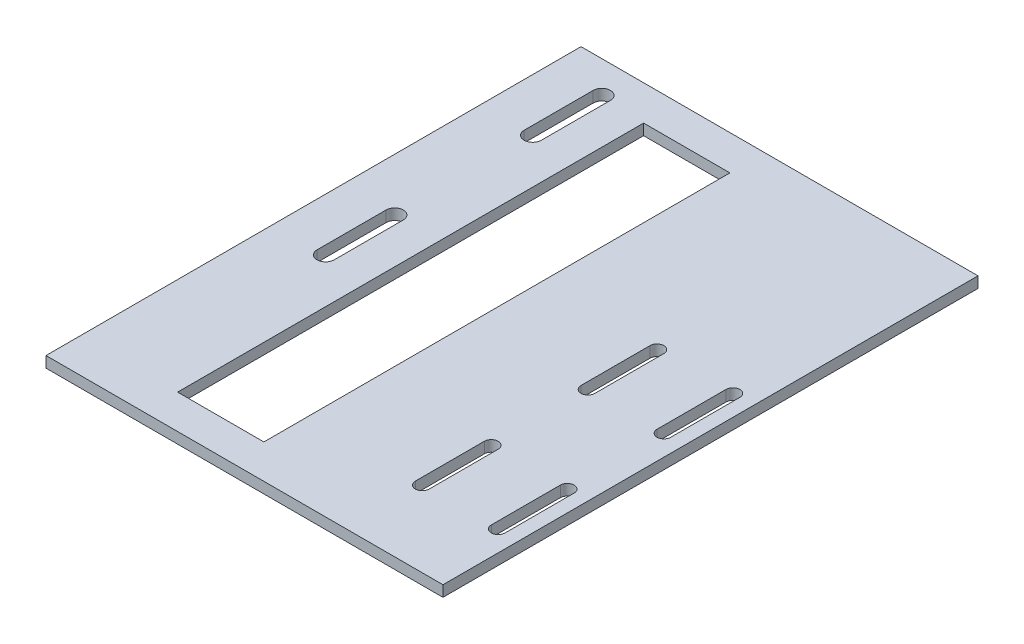
ISO-10303-21;
HEADER;
FILE_DESCRIPTION(('STEP AP214'),'2;1');
FILE_NAME('part.step','',(''),(''),'','','');
FILE_SCHEMA(('AUTOMOTIVE_DESIGN { 1 0 10303 214 1 1 1 1 }'));
ENDSEC;
DATA;
#1=APPLICATION_CONTEXT('core data for automotive mechanical design processes');
#2=APPLICATION_PROTOCOL_DEFINITION('international standard','automotive_design',2000,#1);
#3=PRODUCT_CONTEXT('',#1,'mechanical');
#4=PRODUCT('Part','Part','',(#3));
#5=PRODUCT_RELATED_PRODUCT_CATEGORY('part','',(#4));
#6=PRODUCT_DEFINITION_FORMATION('','',#4);
#7=PRODUCT_DEFINITION_CONTEXT('part definition',#1,'design');
#8=PRODUCT_DEFINITION('design','',#6,#7);
#9=PRODUCT_DEFINITION_SHAPE('','',#8);
#10=(LENGTH_UNIT() NAMED_UNIT(*) SI_UNIT(.MILLI.,.METRE.));
#11=(NAMED_UNIT(*) PLANE_ANGLE_UNIT() SI_UNIT($,.RADIAN.));
#12=(NAMED_UNIT(*) SI_UNIT($,.STERADIAN.) SOLID_ANGLE_UNIT());
#13=UNCERTAINTY_MEASURE_WITH_UNIT(LENGTH_MEASURE(1.E-05),#10,'distance_accuracy_value','');
#14=(GEOMETRIC_REPRESENTATION_CONTEXT(3) GLOBAL_UNCERTAINTY_ASSIGNED_CONTEXT((#13)) GLOBAL_UNIT_ASSIGNED_CONTEXT((#10,
#11,#12)) REPRESENTATION_CONTEXT('',''));
#15=CARTESIAN_POINT('',(0.,0.,0.));
#16=DIRECTION('',(0.,0.,1.));
#17=DIRECTION('',(1.,0.,0.));
#18=AXIS2_PLACEMENT_3D('',#15,#16,#17);
#19=CARTESIAN_POINT('',(0.,3.175,0.));
#20=DIRECTION('',(0.,-1.,0.));
#21=DIRECTION('',(0.,0.,-1.));
#22=AXIS2_PLACEMENT_3D('',#19,#20,#21);
#23=PLANE('',#22);
#24=CARTESIAN_POINT('',(61.6743334663015,3.175,40.3481884473829));
#25=DIRECTION('',(0.,1.,0.));
#26=DIRECTION('',(0.,0.,1.));
#27=AXIS2_PLACEMENT_3D('',#24,#25,#26);
#28=CIRCLE('',#27,1.99999999999983);
#29=CARTESIAN_POINT('',(59.6743334663016,3.175,40.3481884473829));
#30=VERTEX_POINT('',#29);
#31=CARTESIAN_POINT('',(63.6743334663013,3.175,40.3481884473829));
#32=VERTEX_POINT('',#31);
#33=EDGE_CURVE('E297',#30,#32,#28,.T.);
#34=ORIENTED_EDGE('',*,*,#33,.F.);
#35=DIRECTION('',(0.,0.,1.));
#36=VECTOR('',#35,1.);
#37=CARTESIAN_POINT('',(59.6743334663016,3.175,40.3481884473829));
#38=LINE('',#37,#36);
#39=CARTESIAN_POINT('',(59.6743334663016,3.175,20.3481884473829));
#40=VERTEX_POINT('',#39);
#41=EDGE_CURVE('E308',#40,#30,#38,.T.);
#42=ORIENTED_EDGE('',*,*,#41,.F.);
#43=CARTESIAN_POINT('',(61.6743334663016,3.175,20.3481884473829));
#44=DIRECTION('',(0.,1.,0.));
#45=DIRECTION('',(0.,0.,1.));
#46=AXIS2_PLACEMENT_3D('',#43,#44,#45);
#47=CIRCLE('',#46,1.99999999999982);
#48=CARTESIAN_POINT('',(63.6743334663015,3.175,20.3481884473829));
#49=VERTEX_POINT('',#48);
#50=EDGE_CURVE('E304',#49,#40,#47,.T.);
#51=ORIENTED_EDGE('',*,*,#50,.F.);
#52=DIRECTION('',(0.,0.,-1.));
#53=VECTOR('',#52,1.);
#54=CARTESIAN_POINT('',(63.6743334663013,3.175,40.3481884473829));
#55=LINE('',#54,#53);
#56=EDGE_CURVE('E300',#32,#49,#55,.T.);
#57=ORIENTED_EDGE('',*,*,#56,.F.);
#58=EDGE_LOOP('',(#34,#42,#51,#57));
#59=FACE_BOUND('',#58,.T.);
#60=CARTESIAN_POINT('',(-32.086624165376,3.175,-3.42736647473671));
#61=DIRECTION('',(0.,1.,0.));
#62=DIRECTION('',(0.,0.,1.));
#63=AXIS2_PLACEMENT_3D('',#60,#61,#62);
#64=CIRCLE('',#63,2.5);
#65=CARTESIAN_POINT('',(-34.586624165376,3.175,-3.42736647473671));
#66=VERTEX_POINT('',#65);
#67=CARTESIAN_POINT('',(-29.586624165376,3.175,-3.42736647473671));
#68=VERTEX_POINT('',#67);
#69=EDGE_CURVE('E383',#66,#68,#64,.T.);
#70=ORIENTED_EDGE('',*,*,#69,.F.);
#71=DIRECTION('',(0.,0.,1.));
#72=VECTOR('',#71,1.);
#73=CARTESIAN_POINT('',(-34.586624165376,3.175,-3.42736647473671));
#74=LINE('',#73,#72);
#75=CARTESIAN_POINT('',(-34.586624165376,3.175,-23.4273664747367));
#76=VERTEX_POINT('',#75);
#77=EDGE_CURVE('E394',#76,#66,#74,.T.);
#78=ORIENTED_EDGE('',*,*,#77,.F.);
#79=CARTESIAN_POINT('',(-32.086624165376,3.175,-23.4273664747367));
#80=DIRECTION('',(0.,1.,0.));
#81=DIRECTION('',(0.,0.,1.));
#82=AXIS2_PLACEMENT_3D('',#79,#80,#81);
#83=CIRCLE('',#82,2.5);
#84=CARTESIAN_POINT('',(-29.586624165376,3.175,-23.4273664747367));
#85=VERTEX_POINT('',#84);
#86=EDGE_CURVE('E390',#85,#76,#83,.T.);
#87=ORIENTED_EDGE('',*,*,#86,.F.);
#88=DIRECTION('',(0.,0.,-1.));
#89=VECTOR('',#88,1.);
#90=CARTESIAN_POINT('',(-29.586624165376,3.175,-3.42736647473671));
#91=LINE('',#90,#89);
#92=EDGE_CURVE('E386',#68,#85,#91,.T.);
#93=ORIENTED_EDGE('',*,*,#92,.F.);
#94=EDGE_LOOP('',(#70,#78,#87,#93));
#95=FACE_BOUND('',#94,.T.);
#96=CARTESIAN_POINT('',(39.6743334663006,3.175,-7.65181155261708));
#97=DIRECTION('',(0.,1.,0.));
#98=DIRECTION('',(0.,0.,-1.));
#99=AXIS2_PLACEMENT_3D('',#96,#97,#98);
#100=CIRCLE('',#99,2.);
#101=CARTESIAN_POINT('',(37.6743334663006,3.175,-7.65181155261708));
#102=VERTEX_POINT('',#101);
#103=CARTESIAN_POINT('',(41.6743334663006,3.175,-7.65181155261708));
#104=VERTEX_POINT('',#103);
#105=EDGE_CURVE('E469',#102,#104,#100,.T.);
#106=ORIENTED_EDGE('',*,*,#105,.F.);
#107=DIRECTION('',(0.,0.,1.));
#108=VECTOR('',#107,1.);
#109=CARTESIAN_POINT('',(37.6743334663006,3.175,-7.65181155261708));
#110=LINE('',#109,#108);
#111=CARTESIAN_POINT('',(37.6743334663006,3.175,-27.6518115526171));
#112=VERTEX_POINT('',#111);
#113=EDGE_CURVE('E480',#112,#102,#110,.T.);
#114=ORIENTED_EDGE('',*,*,#113,.F.);
#115=CARTESIAN_POINT('',(39.6743334663006,3.175,-27.6518115526171));
#116=DIRECTION('',(0.,1.,0.));
#117=DIRECTION('',(0.,0.,-1.));
#118=AXIS2_PLACEMENT_3D('',#115,#116,#117);
#119=CIRCLE('',#118,2.);
#120=CARTESIAN_POINT('',(41.6743334663006,3.175,-27.6518115526171));
#121=VERTEX_POINT('',#120);
#122=EDGE_CURVE('E476',#121,#112,#119,.T.);
#123=ORIENTED_EDGE('',*,*,#122,.F.);
#124=DIRECTION('',(0.,0.,-1.));
#125=VECTOR('',#124,1.);
#126=CARTESIAN_POINT('',(41.6743334663006,3.175,-7.65181155261708));
#127=LINE('',#126,#125);
#128=EDGE_CURVE('E472',#104,#121,#127,.T.);
#129=ORIENTED_EDGE('',*,*,#128,.F.);
#130=EDGE_LOOP('',(#106,#114,#123,#129));
#131=FACE_BOUND('',#130,.T.);
#132=DIRECTION('',(1.,0.,0.));
#133=VECTOR('',#132,1.);
#134=CARTESIAN_POINT('',(67.674333466301,3.175,62.3481884473829));
#135=LINE('',#134,#133);
#136=CARTESIAN_POINT('',(-47.325666533699,3.175,62.3481884473829));
#137=VERTEX_POINT('',#136);
#138=CARTESIAN_POINT('',(67.674333466301,3.175,62.3481884473829));
#139=VERTEX_POINT('',#138);
#140=EDGE_CURVE('E555',#137,#139,#135,.T.);
#141=ORIENTED_EDGE('',*,*,#140,.T.);
#142=DIRECTION('',(0.,0.,-1.));
#143=VECTOR('',#142,1.);
#144=CARTESIAN_POINT('',(67.674333466301,3.175,-92.6518115526171));
#145=LINE('',#144,#143);
#146=CARTESIAN_POINT('',(67.674333466301,3.175,-92.6518115526171));
#147=VERTEX_POINT('',#146);
#148=EDGE_CURVE('E559',#139,#147,#145,.T.);
#149=ORIENTED_EDGE('',*,*,#148,.T.);
#150=DIRECTION('',(-1.,0.,0.));
#151=VECTOR('',#150,1.);
#152=CARTESIAN_POINT('',(67.674333466301,3.175,-92.6518115526171));
#153=LINE('',#152,#151);
#154=CARTESIAN_POINT('',(-47.325666533699,3.175,-92.6518115526171));
#155=VERTEX_POINT('',#154);
#156=EDGE_CURVE('E563',#147,#155,#153,.T.);
#157=ORIENTED_EDGE('',*,*,#156,.T.);
#158=DIRECTION('',(0.,0.,1.));
#159=VECTOR('',#158,1.);
#160=CARTESIAN_POINT('',(-47.325666533699,3.175,27.0445653421485));
#161=LINE('',#160,#159);
#162=EDGE_CURVE('E566',#155,#137,#161,.T.);
#163=ORIENTED_EDGE('',*,*,#162,.T.);
#164=EDGE_LOOP('',(#141,#149,#157,#163));
#165=FACE_BOUND('',#164,.T.);
#166=DIRECTION('',(0.,0.,1.));
#167=VECTOR('',#166,1.);
#168=CARTESIAN_POINT('',(-19.0866241653807,3.175,-82.5395192353381));
#169=LINE('',#168,#167);
#170=CARTESIAN_POINT('',(-19.0866241653807,3.175,-82.5395192353381));
#171=VERTEX_POINT('',#170);
#172=CARTESIAN_POINT('',(-19.0866241653807,3.175,52.4604807646619));
#173=VERTEX_POINT('',#172);
#174=EDGE_CURVE('E512',#171,#173,#169,.T.);
#175=ORIENTED_EDGE('',*,*,#174,.F.);
#176=DIRECTION('',(-1.,0.,0.));
#177=VECTOR('',#176,1.);
#178=CARTESIAN_POINT('',(-19.0866241653807,3.175,-82.5395192353381));
#179=LINE('',#178,#177);
#180=CARTESIAN_POINT('',(5.91337583461932,3.175,-82.5395192353381));
#181=VERTEX_POINT('',#180);
#182=EDGE_CURVE('E523',#181,#171,#179,.T.);
#183=ORIENTED_EDGE('',*,*,#182,.F.);
#184=DIRECTION('',(0.,0.,-1.));
#185=VECTOR('',#184,1.);
#186=CARTESIAN_POINT('',(5.91337583461932,3.175,-82.5395192353381));
#187=LINE('',#186,#185);
#188=CARTESIAN_POINT('',(5.91337583461935,3.175,52.4604807646619));
#189=VERTEX_POINT('',#188);
#190=EDGE_CURVE('E519',#189,#181,#187,.T.);
#191=ORIENTED_EDGE('',*,*,#190,.F.);
#192=DIRECTION('',(1.,0.,0.));
#193=VECTOR('',#192,1.);
#194=CARTESIAN_POINT('',(-19.0866241653807,3.175,52.4604807646619));
#195=LINE('',#194,#193);
#196=EDGE_CURVE('E515',#173,#189,#195,.T.);
#197=ORIENTED_EDGE('',*,*,#196,.F.);
#198=EDGE_LOOP('',(#175,#183,#191,#197));
#199=FACE_BOUND('',#198,.T.);
#200=CARTESIAN_POINT('',(-32.086624165376,3.175,-63.4273664747312));
#201=DIRECTION('',(0.,1.,0.));
#202=DIRECTION('',(0.,0.,1.));
#203=AXIS2_PLACEMENT_3D('',#200,#201,#202);
#204=CIRCLE('',#203,2.5);
#205=CARTESIAN_POINT('',(-34.586624165376,3.175,-63.4273664747312));
#206=VERTEX_POINT('',#205);
#207=CARTESIAN_POINT('',(-29.586624165376,3.175,-63.4273664747312));
#208=VERTEX_POINT('',#207);
#209=EDGE_CURVE('E426',#206,#208,#204,.T.);
#210=ORIENTED_EDGE('',*,*,#209,.F.);
#211=DIRECTION('',(0.,0.,1.));
#212=VECTOR('',#211,1.);
#213=CARTESIAN_POINT('',(-34.586624165376,3.175,-63.4273664747312));
#214=LINE('',#213,#212);
#215=CARTESIAN_POINT('',(-34.586624165376,3.175,-83.4273664747312));
#216=VERTEX_POINT('',#215);
#217=EDGE_CURVE('E437',#216,#206,#214,.T.);
#218=ORIENTED_EDGE('',*,*,#217,.F.);
#219=CARTESIAN_POINT('',(-32.086624165376,3.175,-83.4273664747312));
#220=DIRECTION('',(0.,1.,0.));
#221=DIRECTION('',(0.,0.,1.));
#222=AXIS2_PLACEMENT_3D('',#219,#220,#221);
#223=CIRCLE('',#222,2.5);
#224=CARTESIAN_POINT('',(-29.586624165376,3.175,-83.4273664747312));
#225=VERTEX_POINT('',#224);
#226=EDGE_CURVE('E433',#225,#216,#223,.T.);
#227=ORIENTED_EDGE('',*,*,#226,.F.);
#228=DIRECTION('',(0.,0.,-1.));
#229=VECTOR('',#228,1.);
#230=CARTESIAN_POINT('',(-29.586624165376,3.175,-63.4273664747312));
#231=LINE('',#230,#229);
#232=EDGE_CURVE('E429',#208,#225,#231,.T.);
#233=ORIENTED_EDGE('',*,*,#232,.F.);
#234=EDGE_LOOP('',(#210,#218,#227,#233));
#235=FACE_BOUND('',#234,.T.);
#236=CARTESIAN_POINT('',(61.6743334663015,3.175,-7.65181155261708));
#237=DIRECTION('',(0.,1.,0.));
#238=DIRECTION('',(0.,0.,1.));
#239=AXIS2_PLACEMENT_3D('',#236,#237,#238);
#240=CIRCLE('',#239,2.);
#241=CARTESIAN_POINT('',(59.6743334663015,3.175,-7.65181155261708));
#242=VERTEX_POINT('',#241);
#243=CARTESIAN_POINT('',(63.6743334663015,3.175,-7.65181155261708));
#244=VERTEX_POINT('',#243);
#245=EDGE_CURVE('E340',#242,#244,#240,.T.);
#246=ORIENTED_EDGE('',*,*,#245,.F.);
#247=DIRECTION('',(0.,0.,1.));
#248=VECTOR('',#247,1.);
#249=CARTESIAN_POINT('',(59.6743334663015,3.175,-7.65181155261708));
#250=LINE('',#249,#248);
#251=CARTESIAN_POINT('',(59.6743334663015,3.175,-27.6518115526171));
#252=VERTEX_POINT('',#251);
#253=EDGE_CURVE('E351',#252,#242,#250,.T.);
#254=ORIENTED_EDGE('',*,*,#253,.F.);
#255=CARTESIAN_POINT('',(61.6743334663015,3.175,-27.6518115526171));
#256=DIRECTION('',(0.,1.,0.));
#257=DIRECTION('',(0.,0.,1.));
#258=AXIS2_PLACEMENT_3D('',#255,#256,#257);
#259=CIRCLE('',#258,2.);
#260=CARTESIAN_POINT('',(63.6743334663015,3.175,-27.6518115526171));
#261=VERTEX_POINT('',#260);
#262=EDGE_CURVE('E347',#261,#252,#259,.T.);
#263=ORIENTED_EDGE('',*,*,#262,.F.);
#264=DIRECTION('',(0.,0.,-1.));
#265=VECTOR('',#264,1.);
#266=CARTESIAN_POINT('',(63.6743334663015,3.175,-7.65181155261708));
#267=LINE('',#266,#265);
#268=EDGE_CURVE('E343',#244,#261,#267,.T.);
#269=ORIENTED_EDGE('',*,*,#268,.F.);
#270=EDGE_LOOP('',(#246,#254,#263,#269));
#271=FACE_BOUND('',#270,.T.);
#272=CARTESIAN_POINT('',(39.6743334663006,3.175,40.3481884473829));
#273=DIRECTION('',(0.,1.,0.));
#274=DIRECTION('',(0.,0.,-1.));
#275=AXIS2_PLACEMENT_3D('',#272,#273,#274);
#276=CIRCLE('',#275,1.99999999999983);
#277=CARTESIAN_POINT('',(37.6743334663007,3.175,40.3481884473829));
#278=VERTEX_POINT('',#277);
#279=CARTESIAN_POINT('',(41.6743334663004,3.175,40.3481884473829));
#280=VERTEX_POINT('',#279);
#281=EDGE_CURVE('E249',#278,#280,#276,.T.);
#282=ORIENTED_EDGE('',*,*,#281,.F.);
#283=DIRECTION('',(0.,0.,1.));
#284=VECTOR('',#283,1.);
#285=CARTESIAN_POINT('',(37.6743334663007,3.175,40.3481884473829));
#286=LINE('',#285,#284);
#287=CARTESIAN_POINT('',(37.6743334663008,3.175,20.3481884473829));
#288=VERTEX_POINT('',#287);
#289=EDGE_CURVE('E275',#288,#278,#286,.T.);
#290=ORIENTED_EDGE('',*,*,#289,.F.);
#291=CARTESIAN_POINT('',(39.6743334663004,3.175,20.3481884473829));
#292=DIRECTION('',(0.,1.,0.));
#293=DIRECTION('',(0.,0.,-1.));
#294=AXIS2_PLACEMENT_3D('',#291,#292,#293);
#295=CIRCLE('',#294,1.99999999999982);
#296=CARTESIAN_POINT('',(41.6743334663004,3.175,20.3481884473829));
#297=VERTEX_POINT('',#296);
#298=EDGE_CURVE('E271',#297,#288,#295,.T.);
#299=ORIENTED_EDGE('',*,*,#298,.F.);
#300=DIRECTION('',(0.,0.,-1.));
#301=VECTOR('',#300,1.);
#302=CARTESIAN_POINT('',(41.6743334663004,3.175,40.3481884473829));
#303=LINE('',#302,#301);
#304=EDGE_CURVE('E258',#280,#297,#303,.T.);
#305=ORIENTED_EDGE('',*,*,#304,.F.);
#306=EDGE_LOOP('',(#282,#290,#299,#305));
#307=FACE_BOUND('',#306,.T.);
#308=ADVANCED_FACE('F39',(#59,#95,#131,#165,#199,#235,#271,#307),#23,.F.);
#309=CARTESIAN_POINT('',(0.,0.,0.));
#310=DIRECTION('',(0.,-1.,0.));
#311=DIRECTION('',(0.,0.,-1.));
#312=AXIS2_PLACEMENT_3D('',#309,#310,#311);
#313=PLANE('',#312);
#314=DIRECTION('',(1.,0.,0.));
#315=VECTOR('',#314,1.);
#316=CARTESIAN_POINT('',(67.674333466301,0.,62.3481884473829));
#317=LINE('',#316,#315);
#318=CARTESIAN_POINT('',(-47.325666533699,0.,62.3481884473829));
#319=VERTEX_POINT('',#318);
#320=CARTESIAN_POINT('',(67.674333466301,0.,62.3481884473829));
#321=VERTEX_POINT('',#320);
#322=EDGE_CURVE('E554',#319,#321,#317,.T.);
#323=ORIENTED_EDGE('',*,*,#322,.F.);
#324=DIRECTION('',(0.,0.,1.));
#325=VECTOR('',#324,1.);
#326=CARTESIAN_POINT('',(-47.325666533699,0.,62.3481884473829));
#327=LINE('',#326,#325);
#328=CARTESIAN_POINT('',(-47.325666533699,0.,-92.6518115526171));
#329=VERTEX_POINT('',#328);
#330=EDGE_CURVE('E560',#329,#319,#327,.T.);
#331=ORIENTED_EDGE('',*,*,#330,.F.);
#332=DIRECTION('',(-1.,0.,0.));
#333=VECTOR('',#332,1.);
#334=CARTESIAN_POINT('',(67.674333466301,0.,-92.6518115526171));
#335=LINE('',#334,#333);
#336=CARTESIAN_POINT('',(67.674333466301,0.,-92.6518115526171));
#337=VERTEX_POINT('',#336);
#338=EDGE_CURVE('E576',#337,#329,#335,.T.);
#339=ORIENTED_EDGE('',*,*,#338,.F.);
#340=DIRECTION('',(0.,0.,-1.));
#341=VECTOR('',#340,1.);
#342=CARTESIAN_POINT('',(67.674333466301,0.,-92.6518115526171));
#343=LINE('',#342,#341);
#344=EDGE_CURVE('E573',#321,#337,#343,.T.);
#345=ORIENTED_EDGE('',*,*,#344,.F.);
#346=EDGE_LOOP('',(#323,#331,#339,#345));
#347=FACE_BOUND('',#346,.T.);
#348=DIRECTION('',(-1.,0.,0.));
#349=VECTOR('',#348,1.);
#350=CARTESIAN_POINT('',(-19.0866241653807,0.,-82.5395192353381));
#351=LINE('',#350,#349);
#352=CARTESIAN_POINT('',(5.91337583461932,0.,-82.5395192353381));
#353=VERTEX_POINT('',#352);
#354=CARTESIAN_POINT('',(-19.0866241653807,0.,-82.5395192353381));
#355=VERTEX_POINT('',#354);
#356=EDGE_CURVE('E516',#353,#355,#351,.T.);
#357=ORIENTED_EDGE('',*,*,#356,.T.);
#358=DIRECTION('',(0.,0.,1.));
#359=VECTOR('',#358,1.);
#360=CARTESIAN_POINT('',(-19.0866241653807,0.,-82.5395192353381));
#361=LINE('',#360,#359);
#362=CARTESIAN_POINT('',(-19.0866241653807,0.,52.4604807646619));
#363=VERTEX_POINT('',#362);
#364=EDGE_CURVE('E511',#355,#363,#361,.T.);
#365=ORIENTED_EDGE('',*,*,#364,.T.);
#366=DIRECTION('',(1.,0.,0.));
#367=VECTOR('',#366,1.);
#368=CARTESIAN_POINT('',(-19.0866241653807,0.,52.4604807646619));
#369=LINE('',#368,#367);
#370=CARTESIAN_POINT('',(5.91337583461935,0.,52.4604807646619));
#371=VERTEX_POINT('',#370);
#372=EDGE_CURVE('E530',#363,#371,#369,.T.);
#373=ORIENTED_EDGE('',*,*,#372,.T.);
#374=DIRECTION('',(0.,0.,-1.));
#375=VECTOR('',#374,1.);
#376=CARTESIAN_POINT('',(5.91337583461932,0.,-82.5395192353381));
#377=LINE('',#376,#375);
#378=EDGE_CURVE('E534',#371,#353,#377,.T.);
#379=ORIENTED_EDGE('',*,*,#378,.T.);
#380=EDGE_LOOP('',(#357,#365,#373,#379));
#381=FACE_BOUND('',#380,.T.);
#382=DIRECTION('',(0.,0.,1.));
#383=VECTOR('',#382,1.);
#384=CARTESIAN_POINT('',(37.6743334663006,0.,-7.65181155261708));
#385=LINE('',#384,#383);
#386=CARTESIAN_POINT('',(37.6743334663006,0.,-27.6518115526171));
#387=VERTEX_POINT('',#386);
#388=CARTESIAN_POINT('',(37.6743334663006,0.,-7.65181155261708));
#389=VERTEX_POINT('',#388);
#390=EDGE_CURVE('E473',#387,#389,#385,.T.);
#391=ORIENTED_EDGE('',*,*,#390,.T.);
#392=CARTESIAN_POINT('',(39.6743334663006,0.,-7.65181155261708));
#393=DIRECTION('',(0.,1.,0.));
#394=DIRECTION('',(0.,0.,-1.));
#395=AXIS2_PLACEMENT_3D('',#392,#393,#394);
#396=CIRCLE('',#395,2.);
#397=CARTESIAN_POINT('',(41.6743334663006,0.,-7.65181155261708));
#398=VERTEX_POINT('',#397);
#399=EDGE_CURVE('E468',#389,#398,#396,.T.);
#400=ORIENTED_EDGE('',*,*,#399,.T.);
#401=DIRECTION('',(0.,0.,-1.));
#402=VECTOR('',#401,1.);
#403=CARTESIAN_POINT('',(41.6743334663006,0.,-7.65181155261708));
#404=LINE('',#403,#402);
#405=CARTESIAN_POINT('',(41.6743334663006,0.,-27.6518115526171));
#406=VERTEX_POINT('',#405);
#407=EDGE_CURVE('E487',#398,#406,#404,.T.);
#408=ORIENTED_EDGE('',*,*,#407,.T.);
#409=CARTESIAN_POINT('',(39.6743334663006,0.,-27.6518115526171));
#410=DIRECTION('',(0.,1.,0.));
#411=DIRECTION('',(0.,0.,-1.));
#412=AXIS2_PLACEMENT_3D('',#409,#410,#411);
#413=CIRCLE('',#412,2.);
#414=EDGE_CURVE('E491',#406,#387,#413,.T.);
#415=ORIENTED_EDGE('',*,*,#414,.T.);
#416=EDGE_LOOP('',(#391,#400,#408,#415));
#417=FACE_BOUND('',#416,.T.);
#418=DIRECTION('',(0.,0.,1.));
#419=VECTOR('',#418,1.);
#420=CARTESIAN_POINT('',(-34.586624165376,0.,-63.4273664747312));
#421=LINE('',#420,#419);
#422=CARTESIAN_POINT('',(-34.586624165376,0.,-83.4273664747312));
#423=VERTEX_POINT('',#422);
#424=CARTESIAN_POINT('',(-34.586624165376,0.,-63.4273664747312));
#425=VERTEX_POINT('',#424);
#426=EDGE_CURVE('E430',#423,#425,#421,.T.);
#427=ORIENTED_EDGE('',*,*,#426,.T.);
#428=CARTESIAN_POINT('',(-32.086624165376,0.,-63.4273664747312));
#429=DIRECTION('',(0.,1.,0.));
#430=DIRECTION('',(0.,0.,1.));
#431=AXIS2_PLACEMENT_3D('',#428,#429,#430);
#432=CIRCLE('',#431,2.5);
#433=CARTESIAN_POINT('',(-29.586624165376,0.,-63.4273664747312));
#434=VERTEX_POINT('',#433);
#435=EDGE_CURVE('E425',#425,#434,#432,.T.);
#436=ORIENTED_EDGE('',*,*,#435,.T.);
#437=DIRECTION('',(0.,0.,-1.));
#438=VECTOR('',#437,1.);
#439=CARTESIAN_POINT('',(-29.586624165376,0.,-63.4273664747312));
#440=LINE('',#439,#438);
#441=CARTESIAN_POINT('',(-29.586624165376,0.,-83.4273664747312));
#442=VERTEX_POINT('',#441);
#443=EDGE_CURVE('E444',#434,#442,#440,.T.);
#444=ORIENTED_EDGE('',*,*,#443,.T.);
#445=CARTESIAN_POINT('',(-32.086624165376,0.,-83.4273664747312));
#446=DIRECTION('',(0.,1.,0.));
#447=DIRECTION('',(0.,0.,1.));
#448=AXIS2_PLACEMENT_3D('',#445,#446,#447);
#449=CIRCLE('',#448,2.5);
#450=EDGE_CURVE('E448',#442,#423,#449,.T.);
#451=ORIENTED_EDGE('',*,*,#450,.T.);
#452=EDGE_LOOP('',(#427,#436,#444,#451));
#453=FACE_BOUND('',#452,.T.);
#454=DIRECTION('',(0.,0.,1.));
#455=VECTOR('',#454,1.);
#456=CARTESIAN_POINT('',(-34.586624165376,0.,-3.42736647473671));
#457=LINE('',#456,#455);
#458=CARTESIAN_POINT('',(-34.586624165376,0.,-23.4273664747367));
#459=VERTEX_POINT('',#458);
#460=CARTESIAN_POINT('',(-34.586624165376,0.,-3.42736647473671));
#461=VERTEX_POINT('',#460);
#462=EDGE_CURVE('E387',#459,#461,#457,.T.);
#463=ORIENTED_EDGE('',*,*,#462,.T.);
#464=CARTESIAN_POINT('',(-32.086624165376,0.,-3.42736647473671));
#465=DIRECTION('',(0.,1.,0.));
#466=DIRECTION('',(0.,0.,1.));
#467=AXIS2_PLACEMENT_3D('',#464,#465,#466);
#468=CIRCLE('',#467,2.5);
#469=CARTESIAN_POINT('',(-29.586624165376,0.,-3.42736647473671));
#470=VERTEX_POINT('',#469);
#471=EDGE_CURVE('E382',#461,#470,#468,.T.);
#472=ORIENTED_EDGE('',*,*,#471,.T.);
#473=DIRECTION('',(0.,0.,-1.));
#474=VECTOR('',#473,1.);
#475=CARTESIAN_POINT('',(-29.586624165376,0.,-3.42736647473671));
#476=LINE('',#475,#474);
#477=CARTESIAN_POINT('',(-29.586624165376,0.,-23.4273664747367));
#478=VERTEX_POINT('',#477);
#479=EDGE_CURVE('E401',#470,#478,#476,.T.);
#480=ORIENTED_EDGE('',*,*,#479,.T.);
#481=CARTESIAN_POINT('',(-32.086624165376,0.,-23.4273664747367));
#482=DIRECTION('',(0.,1.,0.));
#483=DIRECTION('',(0.,0.,1.));
#484=AXIS2_PLACEMENT_3D('',#481,#482,#483);
#485=CIRCLE('',#484,2.5);
#486=EDGE_CURVE('E405',#478,#459,#485,.T.);
#487=ORIENTED_EDGE('',*,*,#486,.T.);
#488=EDGE_LOOP('',(#463,#472,#480,#487));
#489=FACE_BOUND('',#488,.T.);
#490=DIRECTION('',(0.,0.,1.));
#491=VECTOR('',#490,1.);
#492=CARTESIAN_POINT('',(59.6743334663015,0.,-7.65181155261708));
#493=LINE('',#492,#491);
#494=CARTESIAN_POINT('',(59.6743334663015,0.,-27.6518115526171));
#495=VERTEX_POINT('',#494);
#496=CARTESIAN_POINT('',(59.6743334663015,0.,-7.65181155261708));
#497=VERTEX_POINT('',#496);
#498=EDGE_CURVE('E344',#495,#497,#493,.T.);
#499=ORIENTED_EDGE('',*,*,#498,.T.);
#500=CARTESIAN_POINT('',(61.6743334663015,0.,-7.65181155261708));
#501=DIRECTION('',(0.,1.,0.));
#502=DIRECTION('',(0.,0.,1.));
#503=AXIS2_PLACEMENT_3D('',#500,#501,#502);
#504=CIRCLE('',#503,2.);
#505=CARTESIAN_POINT('',(63.6743334663015,0.,-7.65181155261708));
#506=VERTEX_POINT('',#505);
#507=EDGE_CURVE('E339',#497,#506,#504,.T.);
#508=ORIENTED_EDGE('',*,*,#507,.T.);
#509=DIRECTION('',(0.,0.,-1.));
#510=VECTOR('',#509,1.);
#511=CARTESIAN_POINT('',(63.6743334663015,0.,-7.65181155261708));
#512=LINE('',#511,#510);
#513=CARTESIAN_POINT('',(63.6743334663015,0.,-27.6518115526171));
#514=VERTEX_POINT('',#513);
#515=EDGE_CURVE('E358',#506,#514,#512,.T.);
#516=ORIENTED_EDGE('',*,*,#515,.T.);
#517=CARTESIAN_POINT('',(61.6743334663015,0.,-27.6518115526171));
#518=DIRECTION('',(0.,1.,0.));
#519=DIRECTION('',(0.,0.,1.));
#520=AXIS2_PLACEMENT_3D('',#517,#518,#519);
#521=CIRCLE('',#520,2.);
#522=EDGE_CURVE('E362',#514,#495,#521,.T.);
#523=ORIENTED_EDGE('',*,*,#522,.T.);
#524=EDGE_LOOP('',(#499,#508,#516,#523));
#525=FACE_BOUND('',#524,.T.);
#526=DIRECTION('',(0.,0.,1.));
#527=VECTOR('',#526,1.);
#528=CARTESIAN_POINT('',(59.6743334663016,0.,40.3481884473829));
#529=LINE('',#528,#527);
#530=CARTESIAN_POINT('',(59.6743334663016,0.,20.3481884473829));
#531=VERTEX_POINT('',#530);
#532=CARTESIAN_POINT('',(59.6743334663016,0.,40.3481884473829));
#533=VERTEX_POINT('',#532);
#534=EDGE_CURVE('E301',#531,#533,#529,.T.);
#535=ORIENTED_EDGE('',*,*,#534,.T.);
#536=CARTESIAN_POINT('',(61.6743334663015,0.,40.3481884473829));
#537=DIRECTION('',(0.,1.,0.));
#538=DIRECTION('',(0.,0.,1.));
#539=AXIS2_PLACEMENT_3D('',#536,#537,#538);
#540=CIRCLE('',#539,1.99999999999983);
#541=CARTESIAN_POINT('',(63.6743334663013,0.,40.3481884473829));
#542=VERTEX_POINT('',#541);
#543=EDGE_CURVE('E267',#533,#542,#540,.T.);
#544=ORIENTED_EDGE('',*,*,#543,.T.);
#545=DIRECTION('',(0.,0.,-1.));
#546=VECTOR('',#545,1.);
#547=CARTESIAN_POINT('',(63.6743334663013,0.,40.3481884473829));
#548=LINE('',#547,#546);
#549=CARTESIAN_POINT('',(63.6743334663015,0.,20.3481884473829));
#550=VERTEX_POINT('',#549);
#551=EDGE_CURVE('E315',#542,#550,#548,.T.);
#552=ORIENTED_EDGE('',*,*,#551,.T.);
#553=CARTESIAN_POINT('',(61.6743334663016,0.,20.3481884473829));
#554=DIRECTION('',(0.,1.,0.));
#555=DIRECTION('',(0.,0.,1.));
#556=AXIS2_PLACEMENT_3D('',#553,#554,#555);
#557=CIRCLE('',#556,1.99999999999982);
#558=EDGE_CURVE('E319',#550,#531,#557,.T.);
#559=ORIENTED_EDGE('',*,*,#558,.T.);
#560=EDGE_LOOP('',(#535,#544,#552,#559));
#561=FACE_BOUND('',#560,.T.);
#562=DIRECTION('',(0.,0.,1.));
#563=VECTOR('',#562,1.);
#564=CARTESIAN_POINT('',(37.6743334663007,0.,40.3481884473829));
#565=LINE('',#564,#563);
#566=CARTESIAN_POINT('',(37.6743334663006,0.,20.3481884473829));
#567=VERTEX_POINT('',#566);
#568=CARTESIAN_POINT('',(37.6743334663007,0.,40.3481884473829));
#569=VERTEX_POINT('',#568);
#570=EDGE_CURVE('E259',#567,#569,#565,.T.);
#571=ORIENTED_EDGE('',*,*,#570,.T.);
#572=CARTESIAN_POINT('',(39.6743334663006,0.,40.3481884473829));
#573=DIRECTION('',(0.,1.,0.));
#574=DIRECTION('',(0.,0.,-1.));
#575=AXIS2_PLACEMENT_3D('',#572,#573,#574);
#576=CIRCLE('',#575,1.99999999999983);
#577=CARTESIAN_POINT('',(41.6743334663004,0.,40.3481884473829));
#578=VERTEX_POINT('',#577);
#579=EDGE_CURVE('E63',#569,#578,#576,.T.);
#580=ORIENTED_EDGE('',*,*,#579,.T.);
#581=DIRECTION('',(0.,0.,-1.));
#582=VECTOR('',#581,1.);
#583=CARTESIAN_POINT('',(41.6743334663004,0.,40.3481884473829));
#584=LINE('',#583,#582);
#585=CARTESIAN_POINT('',(41.6743334663004,0.,20.3481884473829));
#586=VERTEX_POINT('',#585);
#587=EDGE_CURVE('E265',#578,#586,#584,.T.);
#588=ORIENTED_EDGE('',*,*,#587,.T.);
#589=CARTESIAN_POINT('',(39.6743334663004,0.,20.3481884473829));
#590=DIRECTION('',(0.,1.,0.));
#591=DIRECTION('',(0.,0.,-1.));
#592=AXIS2_PLACEMENT_3D('',#589,#590,#591);
#593=CIRCLE('',#592,1.99999999999982);
#594=EDGE_CURVE('E284',#586,#567,#593,.T.);
#595=ORIENTED_EDGE('',*,*,#594,.T.);
#596=EDGE_LOOP('',(#571,#580,#588,#595));
#597=FACE_BOUND('',#596,.T.);
#598=ADVANCED_FACE('F599',(#347,#381,#417,#453,#489,#525,#561,#597),#313,.T.);
#599=CARTESIAN_POINT('',(67.674333466301,3.175,62.3481884473829));
#600=DIRECTION('',(0.,0.,-1.));
#601=DIRECTION('',(-1.,0.,0.));
#602=AXIS2_PLACEMENT_3D('',#599,#600,#601);
#603=PLANE('',#602);
#604=ORIENTED_EDGE('',*,*,#322,.T.);
#605=DIRECTION('',(0.,-1.,0.));
#606=VECTOR('',#605,1.);
#607=CARTESIAN_POINT('',(67.674333466301,3.175,62.3481884473829));
#608=LINE('',#607,#606);
#609=EDGE_CURVE('E11',#139,#321,#608,.T.);
#610=ORIENTED_EDGE('',*,*,#609,.F.);
#611=ORIENTED_EDGE('',*,*,#140,.F.);
#612=DIRECTION('',(0.,-1.,0.));
#613=VECTOR('',#612,1.);
#614=CARTESIAN_POINT('',(-47.325666533699,3.175,62.3481884473829));
#615=LINE('',#614,#613);
#616=EDGE_CURVE('E569',#137,#319,#615,.T.);
#617=ORIENTED_EDGE('',*,*,#616,.T.);
#618=EDGE_LOOP('',(#604,#610,#611,#617));
#619=FACE_BOUND('',#618,.T.);
#620=ADVANCED_FACE('F41',(#619),#603,.F.);
#621=CARTESIAN_POINT('',(67.674333466301,3.175,-92.6518115526171));
#622=DIRECTION('',(-1.,0.,0.));
#623=DIRECTION('',(0.,0.,1.));
#624=AXIS2_PLACEMENT_3D('',#621,#622,#623);
#625=PLANE('',#624);
#626=ORIENTED_EDGE('',*,*,#344,.T.);
#627=DIRECTION('',(0.,-1.,0.));
#628=VECTOR('',#627,1.);
#629=CARTESIAN_POINT('',(67.674333466301,3.175,-92.6518115526171));
#630=LINE('',#629,#628);
#631=EDGE_CURVE('E48',#147,#337,#630,.T.);
#632=ORIENTED_EDGE('',*,*,#631,.F.);
#633=ORIENTED_EDGE('',*,*,#148,.F.);
#634=ORIENTED_EDGE('',*,*,#609,.T.);
#635=EDGE_LOOP('',(#626,#632,#633,#634));
#636=FACE_BOUND('',#635,.T.);
#637=ADVANCED_FACE('F610',(#636),#625,.F.);
#638=CARTESIAN_POINT('',(67.674333466301,3.175,-92.6518115526171));
#639=DIRECTION('',(0.,0.,1.));
#640=DIRECTION('',(1.,0.,0.));
#641=AXIS2_PLACEMENT_3D('',#638,#639,#640);
#642=PLANE('',#641);
#643=ORIENTED_EDGE('',*,*,#338,.T.);
#644=DIRECTION('',(0.,-1.,0.));
#645=VECTOR('',#644,1.);
#646=CARTESIAN_POINT('',(-47.325666533699,3.175,-92.6518115526171));
#647=LINE('',#646,#645);
#648=EDGE_CURVE('E585',#155,#329,#647,.T.);
#649=ORIENTED_EDGE('',*,*,#648,.F.);
#650=ORIENTED_EDGE('',*,*,#156,.F.);
#651=ORIENTED_EDGE('',*,*,#631,.T.);
#652=EDGE_LOOP('',(#643,#649,#650,#651));
#653=FACE_BOUND('',#652,.T.);
#654=ADVANCED_FACE('F594',(#653),#642,.F.);
#655=CARTESIAN_POINT('',(-47.325666533699,3.175,62.3481884473829));
#656=DIRECTION('',(1.,0.,0.));
#657=DIRECTION('',(0.,0.,-1.));
#658=AXIS2_PLACEMENT_3D('',#655,#656,#657);
#659=PLANE('',#658);
#660=ORIENTED_EDGE('',*,*,#330,.T.);
#661=ORIENTED_EDGE('',*,*,#616,.F.);
#662=ORIENTED_EDGE('',*,*,#162,.F.);
#663=ORIENTED_EDGE('',*,*,#648,.T.);
#664=EDGE_LOOP('',(#660,#661,#662,#663));
#665=FACE_BOUND('',#664,.T.);
#666=ADVANCED_FACE('F603',(#665),#659,.F.);
#667=CARTESIAN_POINT('',(-19.0866241653807,3.175,-82.5395192353381));
#668=DIRECTION('',(1.,0.,0.));
#669=DIRECTION('',(0.,0.,-1.));
#670=AXIS2_PLACEMENT_3D('',#667,#668,#669);
#671=PLANE('',#670);
#672=ORIENTED_EDGE('',*,*,#364,.F.);
#673=DIRECTION('',(0.,-1.,0.));
#674=VECTOR('',#673,1.);
#675=CARTESIAN_POINT('',(-19.0866241653807,3.175,-82.5395192353381));
#676=LINE('',#675,#674);
#677=EDGE_CURVE('E526',#171,#355,#676,.T.);
#678=ORIENTED_EDGE('',*,*,#677,.F.);
#679=ORIENTED_EDGE('',*,*,#174,.T.);
#680=DIRECTION('',(0.,-1.,0.));
#681=VECTOR('',#680,1.);
#682=CARTESIAN_POINT('',(-19.0866241653807,3.175,52.4604807646619));
#683=LINE('',#682,#681);
#684=EDGE_CURVE('E550',#173,#363,#683,.T.);
#685=ORIENTED_EDGE('',*,*,#684,.T.);
#686=EDGE_LOOP('',(#672,#678,#679,#685));
#687=FACE_BOUND('',#686,.T.);
#688=ADVANCED_FACE('F627',(#687),#671,.T.);
#689=CARTESIAN_POINT('',(-19.0866241653807,3.175,52.4604807646619));
#690=DIRECTION('',(0.,0.,-1.));
#691=DIRECTION('',(-1.,0.,0.));
#692=AXIS2_PLACEMENT_3D('',#689,#690,#691);
#693=PLANE('',#692);
#694=ORIENTED_EDGE('',*,*,#372,.F.);
#695=ORIENTED_EDGE('',*,*,#684,.F.);
#696=ORIENTED_EDGE('',*,*,#196,.T.);
#697=DIRECTION('',(0.,-1.,0.));
#698=VECTOR('',#697,1.);
#699=CARTESIAN_POINT('',(5.91337583461935,3.175,52.4604807646619));
#700=LINE('',#699,#698);
#701=EDGE_CURVE('E547',#189,#371,#700,.T.);
#702=ORIENTED_EDGE('',*,*,#701,.T.);
#703=EDGE_LOOP('',(#694,#695,#696,#702));
#704=FACE_BOUND('',#703,.T.);
#705=ADVANCED_FACE('F634',(#704),#693,.T.);
#706=CARTESIAN_POINT('',(5.91337583461932,3.175,-82.5395192353381));
#707=DIRECTION('',(-1.,0.,0.));
#708=DIRECTION('',(0.,0.,1.));
#709=AXIS2_PLACEMENT_3D('',#706,#707,#708);
#710=PLANE('',#709);
#711=ORIENTED_EDGE('',*,*,#378,.F.);
#712=ORIENTED_EDGE('',*,*,#701,.F.);
#713=ORIENTED_EDGE('',*,*,#190,.T.);
#714=DIRECTION('',(0.,-1.,0.));
#715=VECTOR('',#714,1.);
#716=CARTESIAN_POINT('',(5.91337583461932,3.175,-82.5395192353381));
#717=LINE('',#716,#715);
#718=EDGE_CURVE('E544',#181,#353,#717,.T.);
#719=ORIENTED_EDGE('',*,*,#718,.T.);
#720=EDGE_LOOP('',(#711,#712,#713,#719));
#721=FACE_BOUND('',#720,.T.);
#722=ADVANCED_FACE('F639',(#721),#710,.T.);
#723=CARTESIAN_POINT('',(-19.0866241653807,3.175,-82.5395192353381));
#724=DIRECTION('',(0.,0.,1.));
#725=DIRECTION('',(1.,0.,0.));
#726=AXIS2_PLACEMENT_3D('',#723,#724,#725);
#727=PLANE('',#726);
#728=ORIENTED_EDGE('',*,*,#356,.F.);
#729=ORIENTED_EDGE('',*,*,#718,.F.);
#730=ORIENTED_EDGE('',*,*,#182,.T.);
#731=ORIENTED_EDGE('',*,*,#677,.T.);
#732=EDGE_LOOP('',(#728,#729,#730,#731));
#733=FACE_BOUND('',#732,.T.);
#734=ADVANCED_FACE('F646',(#733),#727,.T.);
#735=CARTESIAN_POINT('',(39.6743334663006,3.175,-7.65181155261708));
#736=DIRECTION('',(0.,-1.,0.));
#737=DIRECTION('',(0.,0.,-1.));
#738=AXIS2_PLACEMENT_3D('',#735,#736,#737);
#739=CYLINDRICAL_SURFACE('',#738,2.);
#740=ORIENTED_EDGE('',*,*,#399,.F.);
#741=DIRECTION('',(0.,-1.,0.));
#742=VECTOR('',#741,1.);
#743=CARTESIAN_POINT('',(37.6743334663006,3.175,-7.65181155261708));
#744=LINE('',#743,#742);
#745=EDGE_CURVE('E483',#102,#389,#744,.T.);
#746=ORIENTED_EDGE('',*,*,#745,.F.);
#747=ORIENTED_EDGE('',*,*,#105,.T.);
#748=DIRECTION('',(0.,-1.,0.));
#749=VECTOR('',#748,1.);
#750=CARTESIAN_POINT('',(41.6743334663006,3.175,-7.65181155261708));
#751=LINE('',#750,#749);
#752=EDGE_CURVE('E507',#104,#398,#751,.T.);
#753=ORIENTED_EDGE('',*,*,#752,.T.);
#754=EDGE_LOOP('',(#740,#746,#747,#753));
#755=FACE_BOUND('',#754,.T.);
#756=ADVANCED_FACE('F734',(#755),#739,.F.);
#757=CARTESIAN_POINT('',(41.6743334663006,3.175,-7.65181155261708));
#758=DIRECTION('',(-1.,0.,0.));
#759=DIRECTION('',(0.,0.,1.));
#760=AXIS2_PLACEMENT_3D('',#757,#758,#759);
#761=PLANE('',#760);
#762=ORIENTED_EDGE('',*,*,#407,.F.);
#763=ORIENTED_EDGE('',*,*,#752,.F.);
#764=ORIENTED_EDGE('',*,*,#128,.T.);
#765=DIRECTION('',(0.,-1.,0.));
#766=VECTOR('',#765,1.);
#767=CARTESIAN_POINT('',(41.6743334663006,3.175,-27.6518115526171));
#768=LINE('',#767,#766);
#769=EDGE_CURVE('E504',#121,#406,#768,.T.);
#770=ORIENTED_EDGE('',*,*,#769,.T.);
#771=EDGE_LOOP('',(#762,#763,#764,#770));
#772=FACE_BOUND('',#771,.T.);
#773=ADVANCED_FACE('F730',(#772),#761,.T.);
#774=CARTESIAN_POINT('',(39.6743334663006,3.175,-27.6518115526171));
#775=DIRECTION('',(0.,-1.,0.));
#776=DIRECTION('',(0.,0.,-1.));
#777=AXIS2_PLACEMENT_3D('',#774,#775,#776);
#778=CYLINDRICAL_SURFACE('',#777,2.);
#779=ORIENTED_EDGE('',*,*,#414,.F.);
#780=ORIENTED_EDGE('',*,*,#769,.F.);
#781=ORIENTED_EDGE('',*,*,#122,.T.);
#782=DIRECTION('',(0.,-1.,0.));
#783=VECTOR('',#782,1.);
#784=CARTESIAN_POINT('',(37.6743334663006,3.175,-27.6518115526171));
#785=LINE('',#784,#783);
#786=EDGE_CURVE('E501',#112,#387,#785,.T.);
#787=ORIENTED_EDGE('',*,*,#786,.T.);
#788=EDGE_LOOP('',(#779,#780,#781,#787));
#789=FACE_BOUND('',#788,.T.);
#790=ADVANCED_FACE('F726',(#789),#778,.F.);
#791=CARTESIAN_POINT('',(37.6743334663006,3.175,-7.65181155261708));
#792=DIRECTION('',(1.,0.,0.));
#793=DIRECTION('',(0.,0.,-1.));
#794=AXIS2_PLACEMENT_3D('',#791,#792,#793);
#795=PLANE('',#794);
#796=ORIENTED_EDGE('',*,*,#390,.F.);
#797=ORIENTED_EDGE('',*,*,#786,.F.);
#798=ORIENTED_EDGE('',*,*,#113,.T.);
#799=ORIENTED_EDGE('',*,*,#745,.T.);
#800=EDGE_LOOP('',(#796,#797,#798,#799));
#801=FACE_BOUND('',#800,.T.);
#802=ADVANCED_FACE('F722',(#801),#795,.T.);
#803=CARTESIAN_POINT('',(-32.086624165376,3.175,-63.4273664747312));
#804=DIRECTION('',(0.,-1.,0.));
#805=DIRECTION('',(0.,0.,-1.));
#806=AXIS2_PLACEMENT_3D('',#803,#804,#805);
#807=CYLINDRICAL_SURFACE('',#806,2.5);
#808=ORIENTED_EDGE('',*,*,#435,.F.);
#809=DIRECTION('',(0.,-1.,0.));
#810=VECTOR('',#809,1.);
#811=CARTESIAN_POINT('',(-34.586624165376,3.175,-63.4273664747312));
#812=LINE('',#811,#810);
#813=EDGE_CURVE('E440',#206,#425,#812,.T.);
#814=ORIENTED_EDGE('',*,*,#813,.F.);
#815=ORIENTED_EDGE('',*,*,#209,.T.);
#816=DIRECTION('',(0.,-1.,0.));
#817=VECTOR('',#816,1.);
#818=CARTESIAN_POINT('',(-29.586624165376,3.175,-63.4273664747312));
#819=LINE('',#818,#817);
#820=EDGE_CURVE('E464',#208,#434,#819,.T.);
#821=ORIENTED_EDGE('',*,*,#820,.T.);
#822=EDGE_LOOP('',(#808,#814,#815,#821));
#823=FACE_BOUND('',#822,.T.);
#824=ADVANCED_FACE('F718',(#823),#807,.F.);
#825=CARTESIAN_POINT('',(-29.586624165376,3.175,-63.4273664747312));
#826=DIRECTION('',(-1.,0.,0.));
#827=DIRECTION('',(0.,0.,1.));
#828=AXIS2_PLACEMENT_3D('',#825,#826,#827);
#829=PLANE('',#828);
#830=ORIENTED_EDGE('',*,*,#443,.F.);
#831=ORIENTED_EDGE('',*,*,#820,.F.);
#832=ORIENTED_EDGE('',*,*,#232,.T.);
#833=DIRECTION('',(0.,-1.,0.));
#834=VECTOR('',#833,1.);
#835=CARTESIAN_POINT('',(-29.586624165376,3.175,-83.4273664747312));
#836=LINE('',#835,#834);
#837=EDGE_CURVE('E461',#225,#442,#836,.T.);
#838=ORIENTED_EDGE('',*,*,#837,.T.);
#839=EDGE_LOOP('',(#830,#831,#832,#838));
#840=FACE_BOUND('',#839,.T.);
#841=ADVANCED_FACE('F714',(#840),#829,.T.);
#842=CARTESIAN_POINT('',(-32.086624165376,3.175,-83.4273664747312));
#843=DIRECTION('',(0.,-1.,0.));
#844=DIRECTION('',(0.,0.,-1.));
#845=AXIS2_PLACEMENT_3D('',#842,#843,#844);
#846=CYLINDRICAL_SURFACE('',#845,2.5);
#847=ORIENTED_EDGE('',*,*,#450,.F.);
#848=ORIENTED_EDGE('',*,*,#837,.F.);
#849=ORIENTED_EDGE('',*,*,#226,.T.);
#850=DIRECTION('',(0.,-1.,0.));
#851=VECTOR('',#850,1.);
#852=CARTESIAN_POINT('',(-34.586624165376,3.175,-83.4273664747312));
#853=LINE('',#852,#851);
#854=EDGE_CURVE('E458',#216,#423,#853,.T.);
#855=ORIENTED_EDGE('',*,*,#854,.T.);
#856=EDGE_LOOP('',(#847,#848,#849,#855));
#857=FACE_BOUND('',#856,.T.);
#858=ADVANCED_FACE('F710',(#857),#846,.F.);
#859=CARTESIAN_POINT('',(-34.586624165376,3.175,-63.4273664747312));
#860=DIRECTION('',(1.,0.,0.));
#861=DIRECTION('',(0.,0.,-1.));
#862=AXIS2_PLACEMENT_3D('',#859,#860,#861);
#863=PLANE('',#862);
#864=ORIENTED_EDGE('',*,*,#426,.F.);
#865=ORIENTED_EDGE('',*,*,#854,.F.);
#866=ORIENTED_EDGE('',*,*,#217,.T.);
#867=ORIENTED_EDGE('',*,*,#813,.T.);
#868=EDGE_LOOP('',(#864,#865,#866,#867));
#869=FACE_BOUND('',#868,.T.);
#870=ADVANCED_FACE('F706',(#869),#863,.T.);
#871=CARTESIAN_POINT('',(-32.086624165376,3.175,-3.42736647473671));
#872=DIRECTION('',(0.,-1.,0.));
#873=DIRECTION('',(0.,0.,-1.));
#874=AXIS2_PLACEMENT_3D('',#871,#872,#873);
#875=CYLINDRICAL_SURFACE('',#874,2.5);
#876=ORIENTED_EDGE('',*,*,#471,.F.);
#877=DIRECTION('',(0.,-1.,0.));
#878=VECTOR('',#877,1.);
#879=CARTESIAN_POINT('',(-34.586624165376,3.175,-3.42736647473671));
#880=LINE('',#879,#878);
#881=EDGE_CURVE('E397',#66,#461,#880,.T.);
#882=ORIENTED_EDGE('',*,*,#881,.F.);
#883=ORIENTED_EDGE('',*,*,#69,.T.);
#884=DIRECTION('',(0.,-1.,0.));
#885=VECTOR('',#884,1.);
#886=CARTESIAN_POINT('',(-29.586624165376,3.175,-3.42736647473671));
#887=LINE('',#886,#885);
#888=EDGE_CURVE('E421',#68,#470,#887,.T.);
#889=ORIENTED_EDGE('',*,*,#888,.T.);
#890=EDGE_LOOP('',(#876,#882,#883,#889));
#891=FACE_BOUND('',#890,.T.);
#892=ADVANCED_FACE('F702',(#891),#875,.F.);
#893=CARTESIAN_POINT('',(-29.586624165376,3.175,-3.42736647473671));
#894=DIRECTION('',(-1.,0.,0.));
#895=DIRECTION('',(0.,0.,1.));
#896=AXIS2_PLACEMENT_3D('',#893,#894,#895);
#897=PLANE('',#896);
#898=ORIENTED_EDGE('',*,*,#479,.F.);
#899=ORIENTED_EDGE('',*,*,#888,.F.);
#900=ORIENTED_EDGE('',*,*,#92,.T.);
#901=DIRECTION('',(0.,-1.,0.));
#902=VECTOR('',#901,1.);
#903=CARTESIAN_POINT('',(-29.586624165376,3.175,-23.4273664747367));
#904=LINE('',#903,#902);
#905=EDGE_CURVE('E418',#85,#478,#904,.T.);
#906=ORIENTED_EDGE('',*,*,#905,.T.);
#907=EDGE_LOOP('',(#898,#899,#900,#906));
#908=FACE_BOUND('',#907,.T.);
#909=ADVANCED_FACE('F698',(#908),#897,.T.);
#910=CARTESIAN_POINT('',(-32.086624165376,3.175,-23.4273664747367));
#911=DIRECTION('',(0.,-1.,0.));
#912=DIRECTION('',(0.,0.,-1.));
#913=AXIS2_PLACEMENT_3D('',#910,#911,#912);
#914=CYLINDRICAL_SURFACE('',#913,2.5);
#915=ORIENTED_EDGE('',*,*,#486,.F.);
#916=ORIENTED_EDGE('',*,*,#905,.F.);
#917=ORIENTED_EDGE('',*,*,#86,.T.);
#918=DIRECTION('',(0.,-1.,0.));
#919=VECTOR('',#918,1.);
#920=CARTESIAN_POINT('',(-34.586624165376,3.175,-23.4273664747367));
#921=LINE('',#920,#919);
#922=EDGE_CURVE('E415',#76,#459,#921,.T.);
#923=ORIENTED_EDGE('',*,*,#922,.T.);
#924=EDGE_LOOP('',(#915,#916,#917,#923));
#925=FACE_BOUND('',#924,.T.);
#926=ADVANCED_FACE('F694',(#925),#914,.F.);
#927=CARTESIAN_POINT('',(-34.586624165376,3.175,-3.42736647473671));
#928=DIRECTION('',(1.,0.,0.));
#929=DIRECTION('',(0.,0.,-1.));
#930=AXIS2_PLACEMENT_3D('',#927,#928,#929);
#931=PLANE('',#930);
#932=ORIENTED_EDGE('',*,*,#462,.F.);
#933=ORIENTED_EDGE('',*,*,#922,.F.);
#934=ORIENTED_EDGE('',*,*,#77,.T.);
#935=ORIENTED_EDGE('',*,*,#881,.T.);
#936=EDGE_LOOP('',(#932,#933,#934,#935));
#937=FACE_BOUND('',#936,.T.);
#938=ADVANCED_FACE('F691',(#937),#931,.T.);
#939=CARTESIAN_POINT('',(61.6743334663015,3.175,-7.65181155261708));
#940=DIRECTION('',(0.,-1.,0.));
#941=DIRECTION('',(0.,0.,-1.));
#942=AXIS2_PLACEMENT_3D('',#939,#940,#941);
#943=CYLINDRICAL_SURFACE('',#942,2.);
#944=ORIENTED_EDGE('',*,*,#507,.F.);
#945=DIRECTION('',(0.,-1.,0.));
#946=VECTOR('',#945,1.);
#947=CARTESIAN_POINT('',(59.6743334663015,3.175,-7.65181155261708));
#948=LINE('',#947,#946);
#949=EDGE_CURVE('E354',#242,#497,#948,.T.);
#950=ORIENTED_EDGE('',*,*,#949,.F.);
#951=ORIENTED_EDGE('',*,*,#245,.T.);
#952=DIRECTION('',(0.,-1.,0.));
#953=VECTOR('',#952,1.);
#954=CARTESIAN_POINT('',(63.6743334663015,3.175,-7.65181155261708));
#955=LINE('',#954,#953);
#956=EDGE_CURVE('E378',#244,#506,#955,.T.);
#957=ORIENTED_EDGE('',*,*,#956,.T.);
#958=EDGE_LOOP('',(#944,#950,#951,#957));
#959=FACE_BOUND('',#958,.T.);
#960=ADVANCED_FACE('F666',(#959),#943,.F.);
#961=CARTESIAN_POINT('',(63.6743334663015,3.175,-7.65181155261708));
#962=DIRECTION('',(-1.,0.,0.));
#963=DIRECTION('',(0.,0.,1.));
#964=AXIS2_PLACEMENT_3D('',#961,#962,#963);
#965=PLANE('',#964);
#966=ORIENTED_EDGE('',*,*,#515,.F.);
#967=ORIENTED_EDGE('',*,*,#956,.F.);
#968=ORIENTED_EDGE('',*,*,#268,.T.);
#969=DIRECTION('',(0.,-1.,0.));
#970=VECTOR('',#969,1.);
#971=CARTESIAN_POINT('',(63.6743334663015,3.175,-27.6518115526171));
#972=LINE('',#971,#970);
#973=EDGE_CURVE('E375',#261,#514,#972,.T.);
#974=ORIENTED_EDGE('',*,*,#973,.T.);
#975=EDGE_LOOP('',(#966,#967,#968,#974));
#976=FACE_BOUND('',#975,.T.);
#977=ADVANCED_FACE('F668',(#976),#965,.T.);
#978=CARTESIAN_POINT('',(61.6743334663015,3.175,-27.6518115526171));
#979=DIRECTION('',(0.,-1.,0.));
#980=DIRECTION('',(0.,0.,-1.));
#981=AXIS2_PLACEMENT_3D('',#978,#979,#980);
#982=CYLINDRICAL_SURFACE('',#981,2.);
#983=ORIENTED_EDGE('',*,*,#522,.F.);
#984=ORIENTED_EDGE('',*,*,#973,.F.);
#985=ORIENTED_EDGE('',*,*,#262,.T.);
#986=DIRECTION('',(0.,-1.,0.));
#987=VECTOR('',#986,1.);
#988=CARTESIAN_POINT('',(59.6743334663015,3.175,-27.6518115526171));
#989=LINE('',#988,#987);
#990=EDGE_CURVE('E372',#252,#495,#989,.T.);
#991=ORIENTED_EDGE('',*,*,#990,.T.);
#992=EDGE_LOOP('',(#983,#984,#985,#991));
#993=FACE_BOUND('',#992,.T.);
#994=ADVANCED_FACE('F677',(#993),#982,.F.);
#995=CARTESIAN_POINT('',(59.6743334663015,3.175,-7.65181155261708));
#996=DIRECTION('',(1.,0.,0.));
#997=DIRECTION('',(0.,0.,-1.));
#998=AXIS2_PLACEMENT_3D('',#995,#996,#997);
#999=PLANE('',#998);
#1000=ORIENTED_EDGE('',*,*,#498,.F.);
#1001=ORIENTED_EDGE('',*,*,#990,.F.);
#1002=ORIENTED_EDGE('',*,*,#253,.T.);
#1003=ORIENTED_EDGE('',*,*,#949,.T.);
#1004=EDGE_LOOP('',(#1000,#1001,#1002,#1003));
#1005=FACE_BOUND('',#1004,.T.);
#1006=ADVANCED_FACE('F675',(#1005),#999,.T.);
#1007=CARTESIAN_POINT('',(61.6743334663015,3.175,40.3481884473829));
#1008=DIRECTION('',(0.,-1.,0.));
#1009=DIRECTION('',(0.,0.,-1.));
#1010=AXIS2_PLACEMENT_3D('',#1007,#1008,#1009);
#1011=CYLINDRICAL_SURFACE('',#1010,1.99999999999983);
#1012=ORIENTED_EDGE('',*,*,#543,.F.);
#1013=DIRECTION('',(0.,-1.,0.));
#1014=VECTOR('',#1013,1.);
#1015=CARTESIAN_POINT('',(59.6743334663016,3.175,40.3481884473829));
#1016=LINE('',#1015,#1014);
#1017=EDGE_CURVE('E311',#30,#533,#1016,.T.);
#1018=ORIENTED_EDGE('',*,*,#1017,.F.);
#1019=ORIENTED_EDGE('',*,*,#33,.T.);
#1020=DIRECTION('',(0.,-1.,0.));
#1021=VECTOR('',#1020,1.);
#1022=CARTESIAN_POINT('',(63.6743334663013,3.175,40.3481884473829));
#1023=LINE('',#1022,#1021);
#1024=EDGE_CURVE('E335',#32,#542,#1023,.T.);
#1025=ORIENTED_EDGE('',*,*,#1024,.T.);
#1026=EDGE_LOOP('',(#1012,#1018,#1019,#1025));
#1027=FACE_BOUND('',#1026,.T.);
#1028=ADVANCED_FACE('F684',(#1027),#1011,.F.);
#1029=CARTESIAN_POINT('',(63.6743334663013,3.175,40.3481884473829));
#1030=DIRECTION('',(-1.,0.,0.));
#1031=DIRECTION('',(0.,0.,1.));
#1032=AXIS2_PLACEMENT_3D('',#1029,#1030,#1031);
#1033=PLANE('',#1032);
#1034=ORIENTED_EDGE('',*,*,#551,.F.);
#1035=ORIENTED_EDGE('',*,*,#1024,.F.);
#1036=ORIENTED_EDGE('',*,*,#56,.T.);
#1037=DIRECTION('',(0.,-1.,0.));
#1038=VECTOR('',#1037,1.);
#1039=CARTESIAN_POINT('',(63.6743334663015,3.175,20.3481884473829));
#1040=LINE('',#1039,#1038);
#1041=EDGE_CURVE('E332',#49,#550,#1040,.T.);
#1042=ORIENTED_EDGE('',*,*,#1041,.T.);
#1043=EDGE_LOOP('',(#1034,#1035,#1036,#1042));
#1044=FACE_BOUND('',#1043,.T.);
#1045=ADVANCED_FACE('F825',(#1044),#1033,.T.);
#1046=CARTESIAN_POINT('',(61.6743334663016,3.175,20.3481884473829));
#1047=DIRECTION('',(0.,-1.,0.));
#1048=DIRECTION('',(0.,0.,-1.));
#1049=AXIS2_PLACEMENT_3D('',#1046,#1047,#1048);
#1050=CYLINDRICAL_SURFACE('',#1049,1.99999999999982);
#1051=ORIENTED_EDGE('',*,*,#558,.F.);
#1052=ORIENTED_EDGE('',*,*,#1041,.F.);
#1053=ORIENTED_EDGE('',*,*,#50,.T.);
#1054=DIRECTION('',(0.,-1.,0.));
#1055=VECTOR('',#1054,1.);
#1056=CARTESIAN_POINT('',(59.6743334663016,3.175,20.3481884473829));
#1057=LINE('',#1056,#1055);
#1058=EDGE_CURVE('E329',#40,#531,#1057,.T.);
#1059=ORIENTED_EDGE('',*,*,#1058,.T.);
#1060=EDGE_LOOP('',(#1051,#1052,#1053,#1059));
#1061=FACE_BOUND('',#1060,.T.);
#1062=ADVANCED_FACE('F834',(#1061),#1050,.F.);
#1063=CARTESIAN_POINT('',(59.6743334663016,3.175,40.3481884473829));
#1064=DIRECTION('',(1.,0.,0.));
#1065=DIRECTION('',(0.,0.,-1.));
#1066=AXIS2_PLACEMENT_3D('',#1063,#1064,#1065);
#1067=PLANE('',#1066);
#1068=ORIENTED_EDGE('',*,*,#534,.F.);
#1069=ORIENTED_EDGE('',*,*,#1058,.F.);
#1070=ORIENTED_EDGE('',*,*,#41,.T.);
#1071=ORIENTED_EDGE('',*,*,#1017,.T.);
#1072=EDGE_LOOP('',(#1068,#1069,#1070,#1071));
#1073=FACE_BOUND('',#1072,.T.);
#1074=ADVANCED_FACE('F844',(#1073),#1067,.T.);
#1075=CARTESIAN_POINT('',(39.6743334663006,3.175,40.3481884473829));
#1076=DIRECTION('',(0.,-1.,0.));
#1077=DIRECTION('',(0.,0.,-1.));
#1078=AXIS2_PLACEMENT_3D('',#1075,#1076,#1077);
#1079=CYLINDRICAL_SURFACE('',#1078,1.99999999999983);
#1080=ORIENTED_EDGE('',*,*,#579,.F.);
#1081=DIRECTION('',(0.,-1.,0.));
#1082=VECTOR('',#1081,1.);
#1083=CARTESIAN_POINT('',(37.6743334663007,3.175,40.3481884473829));
#1084=LINE('',#1083,#1082);
#1085=EDGE_CURVE('E253',#278,#569,#1084,.T.);
#1086=ORIENTED_EDGE('',*,*,#1085,.F.);
#1087=ORIENTED_EDGE('',*,*,#281,.T.);
#1088=DIRECTION('',(0.,-1.,0.));
#1089=VECTOR('',#1088,1.);
#1090=CARTESIAN_POINT('',(41.6743334663004,3.175,40.3481884473829));
#1091=LINE('',#1090,#1089);
#1092=EDGE_CURVE('E252',#280,#578,#1091,.T.);
#1093=ORIENTED_EDGE('',*,*,#1092,.T.);
#1094=EDGE_LOOP('',(#1080,#1086,#1087,#1093));
#1095=FACE_BOUND('',#1094,.T.);
#1096=ADVANCED_FACE('F251',(#1095),#1079,.F.);
#1097=CARTESIAN_POINT('',(41.6743334663004,3.175,40.3481884473829));
#1098=DIRECTION('',(-1.,0.,0.));
#1099=DIRECTION('',(0.,0.,1.));
#1100=AXIS2_PLACEMENT_3D('',#1097,#1098,#1099);
#1101=PLANE('',#1100);
#1102=ORIENTED_EDGE('',*,*,#587,.F.);
#1103=ORIENTED_EDGE('',*,*,#1092,.F.);
#1104=ORIENTED_EDGE('',*,*,#304,.T.);
#1105=DIRECTION('',(0.,-1.,0.));
#1106=VECTOR('',#1105,1.);
#1107=CARTESIAN_POINT('',(41.6743334663004,3.175,20.3481884473829));
#1108=LINE('',#1107,#1106);
#1109=EDGE_CURVE('E268',#297,#586,#1108,.T.);
#1110=ORIENTED_EDGE('',*,*,#1109,.T.);
#1111=EDGE_LOOP('',(#1102,#1103,#1104,#1110));
#1112=FACE_BOUND('',#1111,.T.);
#1113=ADVANCED_FACE('F262',(#1112),#1101,.T.);
#1114=CARTESIAN_POINT('',(39.6743334663004,3.175,20.3481884473829));
#1115=DIRECTION('',(0.,-1.,0.));
#1116=DIRECTION('',(0.,0.,-1.));
#1117=AXIS2_PLACEMENT_3D('',#1114,#1115,#1116);
#1118=CYLINDRICAL_SURFACE('',#1117,1.99999999999982);
#1119=ORIENTED_EDGE('',*,*,#594,.F.);
#1120=ORIENTED_EDGE('',*,*,#1109,.F.);
#1121=ORIENTED_EDGE('',*,*,#298,.T.);
#1122=DIRECTION('',(0.,-1.,0.));
#1123=VECTOR('',#1122,1.);
#1124=CARTESIAN_POINT('',(37.6743334663006,3.175,20.3481884473829));
#1125=LINE('',#1124,#1123);
#1126=EDGE_CURVE('E55',#288,#567,#1125,.T.);
#1127=ORIENTED_EDGE('',*,*,#1126,.T.);
#1128=EDGE_LOOP('',(#1119,#1120,#1121,#1127));
#1129=FACE_BOUND('',#1128,.T.);
#1130=ADVANCED_FACE('F871',(#1129),#1118,.F.);
#1131=CARTESIAN_POINT('',(37.6743334663007,3.175,40.3481884473829));
#1132=DIRECTION('',(1.,0.,0.));
#1133=DIRECTION('',(0.,0.,-1.));
#1134=AXIS2_PLACEMENT_3D('',#1131,#1132,#1133);
#1135=PLANE('',#1134);
#1136=ORIENTED_EDGE('',*,*,#570,.F.);
#1137=ORIENTED_EDGE('',*,*,#1126,.F.);
#1138=ORIENTED_EDGE('',*,*,#289,.T.);
#1139=ORIENTED_EDGE('',*,*,#1085,.T.);
#1140=EDGE_LOOP('',(#1136,#1137,#1138,#1139));
#1141=FACE_BOUND('',#1140,.T.);
#1142=ADVANCED_FACE('F880',(#1141),#1135,.T.);
#1143=CLOSED_SHELL('',(#308,#598,#620,#637,#654,#666,#688,#705,#722,#734,#756,#773,#790,#802,
#824,#841,#858,#870,#892,#909,#926,#938,#960,#977,#994,#1006,#1028,#1045,#1062,#1074,#1096,
#1113,#1130,#1142));
#1144=MANIFOLD_SOLID_BREP('B2',#1143);
#1145=ADVANCED_BREP_SHAPE_REPRESENTATION('',(#18,#1144),#14);
#1146=SHAPE_DEFINITION_REPRESENTATION(#9,#1145);
ENDSEC;
END-ISO-10303-21;
